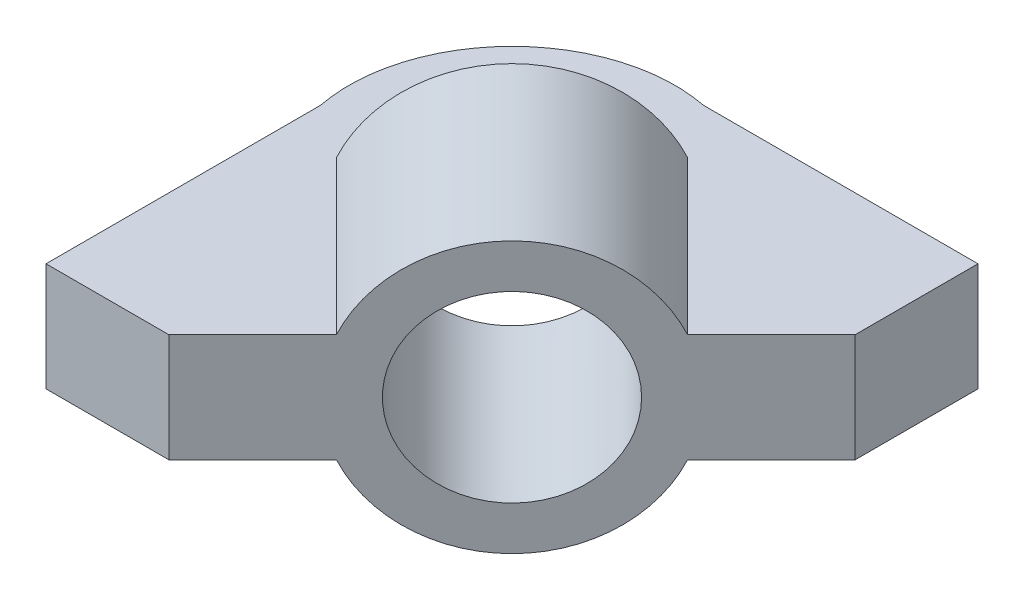
ISO-10303-21;
HEADER;
FILE_DESCRIPTION(('STEP AP214'),'2;1');
FILE_NAME('part.step','',(''),(''),'','','');
FILE_SCHEMA(('AUTOMOTIVE_DESIGN { 1 0 10303 214 1 1 1 1 }'));
ENDSEC;
DATA;
#1=APPLICATION_CONTEXT('core data for automotive mechanical design processes');
#2=APPLICATION_PROTOCOL_DEFINITION('international standard','automotive_design',2000,#1);
#3=PRODUCT_CONTEXT('',#1,'mechanical');
#4=PRODUCT('Part','Part','',(#3));
#5=PRODUCT_RELATED_PRODUCT_CATEGORY('part','',(#4));
#6=PRODUCT_DEFINITION_FORMATION('','',#4);
#7=PRODUCT_DEFINITION_CONTEXT('part definition',#1,'design');
#8=PRODUCT_DEFINITION('design','',#6,#7);
#9=PRODUCT_DEFINITION_SHAPE('','',#8);
#10=(LENGTH_UNIT() NAMED_UNIT(*) SI_UNIT(.MILLI.,.METRE.));
#11=(NAMED_UNIT(*) PLANE_ANGLE_UNIT() SI_UNIT($,.RADIAN.));
#12=(NAMED_UNIT(*) SI_UNIT($,.STERADIAN.) SOLID_ANGLE_UNIT());
#13=UNCERTAINTY_MEASURE_WITH_UNIT(LENGTH_MEASURE(1.E-05),#10,'distance_accuracy_value','');
#14=(GEOMETRIC_REPRESENTATION_CONTEXT(3) GLOBAL_UNCERTAINTY_ASSIGNED_CONTEXT((#13)) GLOBAL_UNIT_ASSIGNED_CONTEXT((#10,
#11,#12)) REPRESENTATION_CONTEXT('',''));
#15=CARTESIAN_POINT('',(0.,0.,0.));
#16=DIRECTION('',(0.,0.,1.));
#17=DIRECTION('',(1.,0.,0.));
#18=AXIS2_PLACEMENT_3D('',#15,#16,#17);
#19=CARTESIAN_POINT('',(0.,3.,0.));
#20=DIRECTION('',(0.,1.,0.));
#21=DIRECTION('',(0.,0.,1.));
#22=AXIS2_PLACEMENT_3D('',#19,#20,#21);
#23=PLANE('',#22);
#24=CARTESIAN_POINT('',(-0.349848925202614,3.,-0.357263409257611));
#25=DIRECTION('',(0.,1.,0.));
#26=DIRECTION('',(0.,0.,1.));
#27=AXIS2_PLACEMENT_3D('',#24,#25,#26);
#28=CIRCLE('',#27,1.5);
#29=CARTESIAN_POINT('',(-0.349848925202614,3.,1.14273659074239));
#30=VERTEX_POINT('',#29);
#31=EDGE_CURVE('E266',#30,#30,#28,.T.);
#32=ORIENTED_EDGE('',*,*,#31,.F.);
#33=EDGE_LOOP('',(#32));
#34=FACE_BOUND('',#33,.T.);
#35=DIRECTION('',(0.707106781186547,0.,-0.707106781186548));
#36=VECTOR('',#35,1.);
#37=CARTESIAN_POINT('',(2.5005764901377,3.,2.5005764901377));
#38=LINE('',#37,#36);
#39=CARTESIAN_POINT('',(-2.35997903366819,3.,7.3611320139436));
#40=VERTEX_POINT('',#39);
#41=CARTESIAN_POINT('',(-0.393868620760068,3.,5.39502160103547));
#42=VERTEX_POINT('',#41);
#43=EDGE_CURVE('E146',#40,#42,#38,.T.);
#44=ORIENTED_EDGE('',*,*,#43,.T.);
#45=DIRECTION('',(0.707106781186547,0.,-0.707106781186548));
#46=VECTOR('',#45,1.);
#47=CARTESIAN_POINT('',(2.5005764901377,3.,2.5005764901377));
#48=LINE('',#47,#46);
#49=CARTESIAN_POINT('',(5.39502160103547,3.,-0.39386862076007));
#50=VERTEX_POINT('',#49);
#51=EDGE_CURVE('E130',#42,#50,#48,.T.);
#52=ORIENTED_EDGE('',*,*,#51,.T.);
#53=CARTESIAN_POINT('',(7.3611320139436,3.,-2.35997903366819));
#54=VERTEX_POINT('',#53);
#55=EDGE_CURVE('E144',#50,#54,#38,.T.);
#56=ORIENTED_EDGE('',*,*,#55,.T.);
#57=DIRECTION('',(0.707106781186548,0.,0.707106781186547));
#58=VECTOR('',#57,1.);
#59=CARTESIAN_POINT('',(7.3611320139436,3.,-2.35997903366819));
#60=LINE('',#59,#58);
#61=CARTESIAN_POINT('',(15.8605555238059,3.,6.13944447619411));
#62=VERTEX_POINT('',#61);
#63=EDGE_CURVE('E166',#62,#54,#60,.F.);
#64=ORIENTED_EDGE('',*,*,#63,.F.);
#65=DIRECTION('',(-0.707106781186548,0.,0.707106781186548));
#66=VECTOR('',#65,1.);
#67=CARTESIAN_POINT('',(11.,3.,11.));
#68=LINE('',#67,#66);
#69=CARTESIAN_POINT('',(20.5,3.,1.5));
#70=VERTEX_POINT('',#69);
#71=EDGE_CURVE('E199',#70,#62,#68,.T.);
#72=ORIENTED_EDGE('',*,*,#71,.F.);
#73=DIRECTION('',(0.,0.,1.));
#74=VECTOR('',#73,1.);
#75=CARTESIAN_POINT('',(20.5,3.,0.));
#76=LINE('',#75,#74);
#77=CARTESIAN_POINT('',(20.5,3.,-5.30330085889911));
#78=VERTEX_POINT('',#77);
#79=EDGE_CURVE('E178',#78,#70,#76,.T.);
#80=ORIENTED_EDGE('',*,*,#79,.F.);
#81=DIRECTION('',(1.,0.,0.));
#82=VECTOR('',#81,1.);
#83=CARTESIAN_POINT('',(0.,3.,-5.30330085889911));
#84=LINE('',#83,#82);
#85=CARTESIAN_POINT('',(5.3033008588991,3.,-5.30330085889911));
#86=VERTEX_POINT('',#85);
#87=EDGE_CURVE('E182',#86,#78,#84,.T.);
#88=ORIENTED_EDGE('',*,*,#87,.F.);
#89=CARTESIAN_POINT('',(3.55763099284482,3.,3.55763099284481));
#90=DIRECTION('',(0.,1.,0.));
#91=DIRECTION('',(0.,0.,1.));
#92=AXIS2_PLACEMENT_3D('',#89,#90,#91);
#93=CIRCLE('',#92,9.03125);
#94=CARTESIAN_POINT('',(-5.3033008588991,3.,5.30330085889911));
#95=VERTEX_POINT('',#94);
#96=EDGE_CURVE('E187',#95,#86,#93,.F.);
#97=ORIENTED_EDGE('',*,*,#96,.F.);
#98=DIRECTION('',(0.,0.,1.));
#99=VECTOR('',#98,1.);
#100=CARTESIAN_POINT('',(-5.30330085889911,3.,0.));
#101=LINE('',#100,#99);
#102=CARTESIAN_POINT('',(-5.3033008588991,3.,20.5));
#103=VERTEX_POINT('',#102);
#104=EDGE_CURVE('E191',#95,#103,#101,.T.);
#105=ORIENTED_EDGE('',*,*,#104,.T.);
#106=DIRECTION('',(1.,0.,0.));
#107=VECTOR('',#106,1.);
#108=CARTESIAN_POINT('',(0.,3.,20.5));
#109=LINE('',#108,#107);
#110=CARTESIAN_POINT('',(1.5,3.,20.5));
#111=VERTEX_POINT('',#110);
#112=EDGE_CURVE('E194',#103,#111,#109,.T.);
#113=ORIENTED_EDGE('',*,*,#112,.T.);
#114=CARTESIAN_POINT('',(6.13944447619411,3.,15.8605555238059));
#115=VERTEX_POINT('',#114);
#116=EDGE_CURVE('E198',#115,#111,#68,.T.);
#117=ORIENTED_EDGE('',*,*,#116,.F.);
#118=DIRECTION('',(0.707106781186548,0.,0.707106781186547));
#119=VECTOR('',#118,1.);
#120=CARTESIAN_POINT('',(-2.35997903366819,3.,7.3611320139436));
#121=LINE('',#120,#119);
#122=EDGE_CURVE('E174',#40,#115,#121,.T.);
#123=ORIENTED_EDGE('',*,*,#122,.F.);
#124=EDGE_LOOP('',(#44,#52,#56,#64,#72,#80,#88,#97,#105,#113,#117,#123));
#125=FACE_BOUND('',#124,.T.);
#126=ADVANCED_FACE('F41',(#34,#125),#23,.T.);
#127=CARTESIAN_POINT('',(0.,-3.,0.));
#128=DIRECTION('',(0.,1.,0.));
#129=DIRECTION('',(0.,0.,1.));
#130=AXIS2_PLACEMENT_3D('',#127,#128,#129);
#131=PLANE('',#130);
#132=CARTESIAN_POINT('',(-0.349848925202614,-3.,-0.357263409257611));
#133=DIRECTION('',(0.,1.,0.));
#134=DIRECTION('',(0.,0.,1.));
#135=AXIS2_PLACEMENT_3D('',#132,#133,#134);
#136=CIRCLE('',#135,1.5);
#137=CARTESIAN_POINT('',(-0.349848925202614,-3.,1.14273659074239));
#138=VERTEX_POINT('',#137);
#139=EDGE_CURVE('E137',#138,#138,#136,.F.);
#140=ORIENTED_EDGE('',*,*,#139,.F.);
#141=EDGE_LOOP('',(#140));
#142=FACE_BOUND('',#141,.T.);
#143=DIRECTION('',(0.707106781186547,0.,-0.707106781186548));
#144=VECTOR('',#143,1.);
#145=CARTESIAN_POINT('',(2.5005764901377,-3.,2.5005764901377));
#146=LINE('',#145,#144);
#147=CARTESIAN_POINT('',(-0.393868620760068,-3.,5.39502160103547));
#148=VERTEX_POINT('',#147);
#149=CARTESIAN_POINT('',(5.39502160103547,-3.,-0.39386862076007));
#150=VERTEX_POINT('',#149);
#151=EDGE_CURVE('E131',#148,#150,#146,.T.);
#152=ORIENTED_EDGE('',*,*,#151,.F.);
#153=DIRECTION('',(0.707106781186547,0.,-0.707106781186548));
#154=VECTOR('',#153,1.);
#155=CARTESIAN_POINT('',(2.5005764901377,-3.,2.5005764901377));
#156=LINE('',#155,#154);
#157=CARTESIAN_POINT('',(-2.35997903366819,-3.,7.3611320139436));
#158=VERTEX_POINT('',#157);
#159=EDGE_CURVE('E50',#158,#148,#156,.T.);
#160=ORIENTED_EDGE('',*,*,#159,.F.);
#161=DIRECTION('',(0.707106781186548,0.,0.707106781186547));
#162=VECTOR('',#161,1.);
#163=CARTESIAN_POINT('',(-2.35997903366819,-3.,7.3611320139436));
#164=LINE('',#163,#162);
#165=CARTESIAN_POINT('',(6.13944447619411,-3.,15.8605555238059));
#166=VERTEX_POINT('',#165);
#167=EDGE_CURVE('E11',#158,#166,#164,.T.);
#168=ORIENTED_EDGE('',*,*,#167,.T.);
#169=DIRECTION('',(-0.707106781186548,0.,0.707106781186548));
#170=VECTOR('',#169,1.);
#171=CARTESIAN_POINT('',(11.,-3.,11.));
#172=LINE('',#171,#170);
#173=CARTESIAN_POINT('',(1.5,-3.,20.5));
#174=VERTEX_POINT('',#173);
#175=EDGE_CURVE('E222',#166,#174,#172,.T.);
#176=ORIENTED_EDGE('',*,*,#175,.T.);
#177=DIRECTION('',(1.,0.,0.));
#178=VECTOR('',#177,1.);
#179=CARTESIAN_POINT('',(0.,-3.,20.5));
#180=LINE('',#179,#178);
#181=CARTESIAN_POINT('',(-5.3033008588991,-3.,20.5));
#182=VERTEX_POINT('',#181);
#183=EDGE_CURVE('E218',#182,#174,#180,.T.);
#184=ORIENTED_EDGE('',*,*,#183,.F.);
#185=DIRECTION('',(0.,0.,1.));
#186=VECTOR('',#185,1.);
#187=CARTESIAN_POINT('',(-5.30330085889911,-3.,0.));
#188=LINE('',#187,#186);
#189=CARTESIAN_POINT('',(-5.3033008588991,-3.,5.30330085889911));
#190=VERTEX_POINT('',#189);
#191=EDGE_CURVE('E215',#190,#182,#188,.T.);
#192=ORIENTED_EDGE('',*,*,#191,.F.);
#193=CARTESIAN_POINT('',(3.55763099284482,-3.,3.55763099284481));
#194=DIRECTION('',(0.,1.,0.));
#195=DIRECTION('',(0.,0.,1.));
#196=AXIS2_PLACEMENT_3D('',#193,#194,#195);
#197=CIRCLE('',#196,9.03125);
#198=CARTESIAN_POINT('',(5.3033008588991,-3.,-5.30330085889911));
#199=VERTEX_POINT('',#198);
#200=EDGE_CURVE('E211',#190,#199,#197,.F.);
#201=ORIENTED_EDGE('',*,*,#200,.T.);
#202=DIRECTION('',(1.,0.,0.));
#203=VECTOR('',#202,1.);
#204=CARTESIAN_POINT('',(0.,-3.,-5.30330085889911));
#205=LINE('',#204,#203);
#206=CARTESIAN_POINT('',(20.5,-3.,-5.30330085889911));
#207=VERTEX_POINT('',#206);
#208=EDGE_CURVE('E207',#199,#207,#205,.T.);
#209=ORIENTED_EDGE('',*,*,#208,.T.);
#210=DIRECTION('',(0.,0.,1.));
#211=VECTOR('',#210,1.);
#212=CARTESIAN_POINT('',(20.5,-3.,0.));
#213=LINE('',#212,#211);
#214=CARTESIAN_POINT('',(20.5,-3.,1.5));
#215=VERTEX_POINT('',#214);
#216=EDGE_CURVE('E177',#207,#215,#213,.T.);
#217=ORIENTED_EDGE('',*,*,#216,.T.);
#218=CARTESIAN_POINT('',(15.8605555238059,-3.,6.1394444761941));
#219=VERTEX_POINT('',#218);
#220=EDGE_CURVE('E183',#215,#219,#172,.T.);
#221=ORIENTED_EDGE('',*,*,#220,.T.);
#222=DIRECTION('',(0.707106781186548,0.,0.707106781186547));
#223=VECTOR('',#222,1.);
#224=CARTESIAN_POINT('',(7.3611320139436,-3.,-2.35997903366819));
#225=LINE('',#224,#223);
#226=CARTESIAN_POINT('',(7.3611320139436,-3.,-2.35997903366819));
#227=VERTEX_POINT('',#226);
#228=EDGE_CURVE('E247',#219,#227,#225,.F.);
#229=ORIENTED_EDGE('',*,*,#228,.T.);
#230=EDGE_CURVE('E244',#150,#227,#156,.T.);
#231=ORIENTED_EDGE('',*,*,#230,.F.);
#232=EDGE_LOOP('',(#152,#160,#168,#176,#184,#192,#201,#209,#217,#221,#229,#231));
#233=FACE_BOUND('',#232,.T.);
#234=ADVANCED_FACE('F305',(#142,#233),#131,.F.);
#235=CARTESIAN_POINT('',(20.5,3.,0.));
#236=DIRECTION('',(1.,0.,0.));
#237=DIRECTION('',(0.,0.,-1.));
#238=AXIS2_PLACEMENT_3D('',#235,#236,#237);
#239=PLANE('',#238);
#240=ORIENTED_EDGE('',*,*,#216,.F.);
#241=DIRECTION('',(0.,-1.,0.));
#242=VECTOR('',#241,1.);
#243=CARTESIAN_POINT('',(20.5,3.,-5.30330085889911));
#244=LINE('',#243,#242);
#245=EDGE_CURVE('E241',#78,#207,#244,.T.);
#246=ORIENTED_EDGE('',*,*,#245,.F.);
#247=ORIENTED_EDGE('',*,*,#79,.T.);
#248=DIRECTION('',(0.,-1.,0.));
#249=VECTOR('',#248,1.);
#250=CARTESIAN_POINT('',(20.5,3.,1.5));
#251=LINE('',#250,#249);
#252=EDGE_CURVE('E203',#70,#215,#251,.T.);
#253=ORIENTED_EDGE('',*,*,#252,.T.);
#254=EDGE_LOOP('',(#240,#246,#247,#253));
#255=FACE_BOUND('',#254,.T.);
#256=ADVANCED_FACE('F43',(#255),#239,.T.);
#257=CARTESIAN_POINT('',(0.,3.,-5.30330085889911));
#258=DIRECTION('',(0.,0.,-1.));
#259=DIRECTION('',(-1.,0.,0.));
#260=AXIS2_PLACEMENT_3D('',#257,#258,#259);
#261=PLANE('',#260);
#262=CARTESIAN_POINT('',(15.,0.,-5.30330085889911));
#263=DIRECTION('',(0.,0.,-1.));
#264=DIRECTION('',(-1.,0.,0.));
#265=AXIS2_PLACEMENT_3D('',#262,#263,#264);
#266=CIRCLE('',#265,1.5);
#267=CARTESIAN_POINT('',(13.5,0.,-5.30330085889911));
#268=VERTEX_POINT('',#267);
#269=EDGE_CURVE('E279',#268,#268,#266,.T.);
#270=ORIENTED_EDGE('',*,*,#269,.F.);
#271=EDGE_LOOP('',(#270));
#272=FACE_BOUND('',#271,.T.);
#273=ORIENTED_EDGE('',*,*,#208,.F.);
#274=DIRECTION('',(0.,-1.,0.));
#275=VECTOR('',#274,1.);
#276=CARTESIAN_POINT('',(5.3033008588991,3.,-5.30330085889911));
#277=LINE('',#276,#275);
#278=EDGE_CURVE('E238',#86,#199,#277,.T.);
#279=ORIENTED_EDGE('',*,*,#278,.F.);
#280=ORIENTED_EDGE('',*,*,#87,.T.);
#281=ORIENTED_EDGE('',*,*,#245,.T.);
#282=EDGE_LOOP('',(#273,#279,#280,#281));
#283=FACE_BOUND('',#282,.T.);
#284=ADVANCED_FACE('F296',(#272,#283),#261,.T.);
#285=CARTESIAN_POINT('',(3.55763099284482,3.,3.55763099284481));
#286=DIRECTION('',(0.,-1.,0.));
#287=DIRECTION('',(0.,0.,-1.));
#288=AXIS2_PLACEMENT_3D('',#285,#286,#287);
#289=CYLINDRICAL_SURFACE('',#288,9.03125);
#290=ORIENTED_EDGE('',*,*,#200,.F.);
#291=DIRECTION('',(0.,-1.,0.));
#292=VECTOR('',#291,1.);
#293=CARTESIAN_POINT('',(-5.3033008588991,3.,5.30330085889911));
#294=LINE('',#293,#292);
#295=EDGE_CURVE('E235',#95,#190,#294,.T.);
#296=ORIENTED_EDGE('',*,*,#295,.F.);
#297=ORIENTED_EDGE('',*,*,#96,.T.);
#298=ORIENTED_EDGE('',*,*,#278,.T.);
#299=EDGE_LOOP('',(#290,#296,#297,#298));
#300=FACE_BOUND('',#299,.T.);
#301=ADVANCED_FACE('F299',(#300),#289,.T.);
#302=CARTESIAN_POINT('',(-5.30330085889911,3.,0.));
#303=DIRECTION('',(1.,0.,0.));
#304=DIRECTION('',(0.,0.,-1.));
#305=AXIS2_PLACEMENT_3D('',#302,#303,#304);
#306=PLANE('',#305);
#307=CARTESIAN_POINT('',(-5.30330085889911,0.,15.));
#308=DIRECTION('',(-1.,0.,0.));
#309=DIRECTION('',(0.,0.,1.));
#310=AXIS2_PLACEMENT_3D('',#307,#308,#309);
#311=CIRCLE('',#310,1.5);
#312=CARTESIAN_POINT('',(-5.30330085889911,0.,16.5));
#313=VERTEX_POINT('',#312);
#314=EDGE_CURVE('E271',#313,#313,#311,.T.);
#315=ORIENTED_EDGE('',*,*,#314,.F.);
#316=EDGE_LOOP('',(#315));
#317=FACE_BOUND('',#316,.T.);
#318=ORIENTED_EDGE('',*,*,#191,.T.);
#319=DIRECTION('',(0.,-1.,0.));
#320=VECTOR('',#319,1.);
#321=CARTESIAN_POINT('',(-5.3033008588991,3.,20.5));
#322=LINE('',#321,#320);
#323=EDGE_CURVE('E231',#103,#182,#322,.T.);
#324=ORIENTED_EDGE('',*,*,#323,.F.);
#325=ORIENTED_EDGE('',*,*,#104,.F.);
#326=ORIENTED_EDGE('',*,*,#295,.T.);
#327=EDGE_LOOP('',(#318,#324,#325,#326));
#328=FACE_BOUND('',#327,.T.);
#329=ADVANCED_FACE('F333',(#317,#328),#306,.F.);
#330=CARTESIAN_POINT('',(0.,3.,20.5));
#331=DIRECTION('',(0.,0.,-1.));
#332=DIRECTION('',(-1.,0.,0.));
#333=AXIS2_PLACEMENT_3D('',#330,#331,#332);
#334=PLANE('',#333);
#335=ORIENTED_EDGE('',*,*,#183,.T.);
#336=DIRECTION('',(0.,-1.,0.));
#337=VECTOR('',#336,1.);
#338=CARTESIAN_POINT('',(1.5,3.,20.5));
#339=LINE('',#338,#337);
#340=EDGE_CURVE('E227',#111,#174,#339,.T.);
#341=ORIENTED_EDGE('',*,*,#340,.F.);
#342=ORIENTED_EDGE('',*,*,#112,.F.);
#343=ORIENTED_EDGE('',*,*,#323,.T.);
#344=EDGE_LOOP('',(#335,#341,#342,#343));
#345=FACE_BOUND('',#344,.T.);
#346=ADVANCED_FACE('F331',(#345),#334,.F.);
#347=CARTESIAN_POINT('',(11.,3.,11.));
#348=DIRECTION('',(0.707106781186547,0.,0.707106781186547));
#349=DIRECTION('',(0.707106781186548,0.,-0.707106781186548));
#350=AXIS2_PLACEMENT_3D('',#347,#348,#349);
#351=PLANE('',#350);
#352=CARTESIAN_POINT('',(11.,0.,11.));
#353=DIRECTION('',(0.707106781186548,0.,0.707106781186547));
#354=DIRECTION('',(0.707106781186547,0.,-0.707106781186548));
#355=AXIS2_PLACEMENT_3D('',#352,#353,#354);
#356=CIRCLE('',#355,5.075);
#357=CARTESIAN_POINT('',(14.5885669145217,0.,7.41143308547827));
#358=VERTEX_POINT('',#357);
#359=EDGE_CURVE('E148',#358,#358,#356,.T.);
#360=ORIENTED_EDGE('',*,*,#359,.F.);
#361=EDGE_LOOP('',(#360));
#362=FACE_BOUND('',#361,.T.);
#363=ORIENTED_EDGE('',*,*,#71,.T.);
#364=CARTESIAN_POINT('',(11.,0.,11.));
#365=DIRECTION('',(0.707106781186548,0.,0.707106781186547));
#366=DIRECTION('',(0.707106781186547,0.,-0.707106781186548));
#367=AXIS2_PLACEMENT_3D('',#364,#365,#366);
#368=CIRCLE('',#367,7.5);
#369=EDGE_CURVE('E171',#62,#115,#368,.T.);
#370=ORIENTED_EDGE('',*,*,#369,.T.);
#371=ORIENTED_EDGE('',*,*,#116,.T.);
#372=ORIENTED_EDGE('',*,*,#340,.T.);
#373=ORIENTED_EDGE('',*,*,#175,.F.);
#374=EDGE_CURVE('E155',#166,#219,#368,.T.);
#375=ORIENTED_EDGE('',*,*,#374,.T.);
#376=ORIENTED_EDGE('',*,*,#220,.F.);
#377=ORIENTED_EDGE('',*,*,#252,.F.);
#378=EDGE_LOOP('',(#363,#370,#371,#372,#373,#375,#376,#377));
#379=FACE_BOUND('',#378,.T.);
#380=ADVANCED_FACE('F317',(#362,#379),#351,.T.);
#381=CARTESIAN_POINT('',(2.5005764901377,0.,2.5005764901377));
#382=DIRECTION('',(0.707106781186548,0.,0.707106781186547));
#383=DIRECTION('',(0.707106781186547,0.,-0.707106781186548));
#384=AXIS2_PLACEMENT_3D('',#381,#382,#383);
#385=CYLINDRICAL_SURFACE('',#384,5.075);
#386=ORIENTED_EDGE('',*,*,#359,.T.);
#387=EDGE_LOOP('',(#386));
#388=FACE_BOUND('',#387,.T.);
#389=CARTESIAN_POINT('',(2.5005764901377,0.,2.5005764901377));
#390=DIRECTION('',(0.707106781186548,0.,0.707106781186547));
#391=DIRECTION('',(0.707106781186547,0.,-0.707106781186548));
#392=AXIS2_PLACEMENT_3D('',#389,#390,#391);
#393=CIRCLE('',#392,5.075);
#394=EDGE_CURVE('E156',#148,#150,#393,.T.);
#395=ORIENTED_EDGE('',*,*,#394,.F.);
#396=CARTESIAN_POINT('',(2.5005764901377,0.,2.5005764901377));
#397=DIRECTION('',(0.707106781186548,0.,0.707106781186547));
#398=DIRECTION('',(0.707106781186547,0.,-0.707106781186548));
#399=AXIS2_PLACEMENT_3D('',#396,#397,#398);
#400=CIRCLE('',#399,5.075);
#401=EDGE_CURVE('E63',#42,#148,#400,.T.);
#402=ORIENTED_EDGE('',*,*,#401,.F.);
#403=EDGE_CURVE('E151',#50,#42,#393,.T.);
#404=ORIENTED_EDGE('',*,*,#403,.F.);
#405=EDGE_CURVE('E127',#150,#50,#400,.T.);
#406=ORIENTED_EDGE('',*,*,#405,.F.);
#407=EDGE_LOOP('',(#395,#402,#404,#406));
#408=FACE_BOUND('',#407,.T.);
#409=ADVANCED_FACE('F152',(#388,#408),#385,.F.);
#410=CARTESIAN_POINT('',(2.5005764901377,0.,2.5005764901377));
#411=DIRECTION('',(0.707106781186548,0.,0.707106781186547));
#412=DIRECTION('',(0.707106781186547,0.,-0.707106781186548));
#413=AXIS2_PLACEMENT_3D('',#410,#411,#412);
#414=PLANE('',#413);
#415=CARTESIAN_POINT('',(2.5005764901377,0.,2.5005764901377));
#416=DIRECTION('',(0.707106781186548,0.,0.707106781186547));
#417=DIRECTION('',(0.707106781186547,0.,-0.707106781186548));
#418=AXIS2_PLACEMENT_3D('',#415,#416,#417);
#419=CIRCLE('',#418,7.5);
#420=EDGE_CURVE('E167',#158,#227,#419,.T.);
#421=ORIENTED_EDGE('',*,*,#420,.F.);
#422=ORIENTED_EDGE('',*,*,#159,.T.);
#423=ORIENTED_EDGE('',*,*,#394,.T.);
#424=ORIENTED_EDGE('',*,*,#230,.T.);
#425=EDGE_LOOP('',(#421,#422,#423,#424));
#426=FACE_BOUND('',#425,.T.);
#427=ADVANCED_FACE('F254',(#426),#414,.F.);
#428=CARTESIAN_POINT('',(2.5005764901377,0.,2.5005764901377));
#429=DIRECTION('',(0.707106781186548,0.,0.707106781186547));
#430=DIRECTION('',(0.707106781186547,0.,-0.707106781186548));
#431=AXIS2_PLACEMENT_3D('',#428,#429,#430);
#432=CYLINDRICAL_SURFACE('',#431,7.5);
#433=ORIENTED_EDGE('',*,*,#167,.F.);
#434=ORIENTED_EDGE('',*,*,#420,.T.);
#435=ORIENTED_EDGE('',*,*,#228,.F.);
#436=ORIENTED_EDGE('',*,*,#374,.F.);
#437=EDGE_LOOP('',(#433,#434,#435,#436));
#438=FACE_BOUND('',#437,.T.);
#439=ADVANCED_FACE('F326',(#438),#432,.T.);
#440=EDGE_CURVE('E161',#54,#40,#419,.T.);
#441=ORIENTED_EDGE('',*,*,#440,.T.);
#442=ORIENTED_EDGE('',*,*,#122,.T.);
#443=ORIENTED_EDGE('',*,*,#369,.F.);
#444=ORIENTED_EDGE('',*,*,#63,.T.);
#445=EDGE_LOOP('',(#441,#442,#443,#444));
#446=FACE_BOUND('',#445,.T.);
#447=ADVANCED_FACE('F354',(#446),#432,.T.);
#448=ORIENTED_EDGE('',*,*,#43,.F.);
#449=ORIENTED_EDGE('',*,*,#440,.F.);
#450=ORIENTED_EDGE('',*,*,#55,.F.);
#451=ORIENTED_EDGE('',*,*,#403,.T.);
#452=EDGE_LOOP('',(#448,#449,#450,#451));
#453=FACE_BOUND('',#452,.T.);
#454=ADVANCED_FACE('F159',(#453),#414,.F.);
#455=CARTESIAN_POINT('',(2.5005764901377,0.,2.5005764901377));
#456=DIRECTION('',(0.707106781186548,0.,0.707106781186547));
#457=DIRECTION('',(0.707106781186547,0.,-0.707106781186548));
#458=AXIS2_PLACEMENT_3D('',#455,#456,#457);
#459=PLANE('',#458);
#460=ORIENTED_EDGE('',*,*,#401,.T.);
#461=ORIENTED_EDGE('',*,*,#151,.T.);
#462=ORIENTED_EDGE('',*,*,#405,.T.);
#463=ORIENTED_EDGE('',*,*,#51,.F.);
#464=EDGE_LOOP('',(#460,#461,#462,#463));
#465=FACE_BOUND('',#464,.T.);
#466=ADVANCED_FACE('F129',(#465),#459,.T.);
#467=CARTESIAN_POINT('',(-0.349848925202614,-7.24264068711929,-0.357263409257611));
#468=DIRECTION('',(0.,1.,0.));
#469=DIRECTION('',(0.,0.,1.));
#470=AXIS2_PLACEMENT_3D('',#467,#468,#469);
#471=CYLINDRICAL_SURFACE('',#470,1.5);
#472=CARTESIAN_POINT('',(-0.349848925202614,-3.,1.14273659074239));
#473=CARTESIAN_POINT('',(-0.349848925202614,-2.9375,1.14273659074239));
#474=CARTESIAN_POINT('',(-0.349848925202614,-2.875,1.14273659074239));
#475=CARTESIAN_POINT('',(-0.349848925202614,-2.75,1.14273659074239));
#476=CARTESIAN_POINT('',(-0.349848925202614,-2.6875,1.14273659074239));
#477=CARTESIAN_POINT('',(-0.349848925202614,-2.5625,1.14273659074239));
#478=CARTESIAN_POINT('',(-0.349848925202614,-2.5,1.14273659074239));
#479=CARTESIAN_POINT('',(-0.349848925202614,-2.375,1.14273659074239));
#480=CARTESIAN_POINT('',(-0.349848925202614,-2.3125,1.14273659074239));
#481=CARTESIAN_POINT('',(-0.349848925202614,-2.1875,1.14273659074239));
#482=CARTESIAN_POINT('',(-0.349848925202614,-2.125,1.14273659074239));
#483=CARTESIAN_POINT('',(-0.349848925202614,-2.,1.14273659074239));
#484=CARTESIAN_POINT('',(-0.349848925202614,-1.9375,1.14273659074239));
#485=CARTESIAN_POINT('',(-0.349848925202614,-1.8125,1.14273659074239));
#486=CARTESIAN_POINT('',(-0.349848925202614,-1.75,1.14273659074239));
#487=CARTESIAN_POINT('',(-0.349848925202614,-1.625,1.14273659074239));
#488=CARTESIAN_POINT('',(-0.349848925202614,-1.5625,1.14273659074239));
#489=CARTESIAN_POINT('',(-0.349848925202614,-1.4375,1.14273659074239));
#490=CARTESIAN_POINT('',(-0.349848925202614,-1.375,1.14273659074239));
#491=CARTESIAN_POINT('',(-0.349848925202614,-1.25,1.14273659074239));
#492=CARTESIAN_POINT('',(-0.349848925202614,-1.1875,1.14273659074239));
#493=CARTESIAN_POINT('',(-0.349848925202614,-1.0625,1.14273659074239));
#494=CARTESIAN_POINT('',(-0.349848925202614,-1.,1.14273659074239));
#495=CARTESIAN_POINT('',(-0.349848925202614,-0.875000000000001,1.14273659074239));
#496=CARTESIAN_POINT('',(-0.349848925202614,-0.812500000000001,1.14273659074239));
#497=CARTESIAN_POINT('',(-0.349848925202614,-0.687500000000001,1.14273659074239));
#498=CARTESIAN_POINT('',(-0.349848925202614,-0.625000000000001,1.14273659074239));
#499=CARTESIAN_POINT('',(-0.349848925202614,-0.5,1.14273659074239));
#500=CARTESIAN_POINT('',(-0.349848925202614,-0.4375,1.14273659074239));
#501=CARTESIAN_POINT('',(-0.349848925202614,-0.312500000000001,1.14273659074239));
#502=CARTESIAN_POINT('',(-0.349848925202614,-0.250000000000001,1.14273659074239));
#503=CARTESIAN_POINT('',(-0.349848925202614,-0.125000000000001,1.14273659074239));
#504=CARTESIAN_POINT('',(-0.349848925202614,-0.0625000000000009,1.14273659074239));
#505=CARTESIAN_POINT('',(-0.349848925202614,0.0624999999999992,1.14273659074239));
#506=CARTESIAN_POINT('',(-0.349848925202614,0.124999999999999,1.14273659074239));
#507=CARTESIAN_POINT('',(-0.349848925202614,0.249999999999999,1.14273659074239));
#508=CARTESIAN_POINT('',(-0.349848925202614,0.312499999999999,1.14273659074239));
#509=CARTESIAN_POINT('',(-0.349848925202614,0.437499999999999,1.14273659074239));
#510=CARTESIAN_POINT('',(-0.349848925202614,0.499999999999999,1.14273659074239));
#511=CARTESIAN_POINT('',(-0.349848925202614,0.624999999999998,1.14273659074239));
#512=CARTESIAN_POINT('',(-0.349848925202614,0.687499999999998,1.14273659074239));
#513=CARTESIAN_POINT('',(-0.349848925202614,0.812499999999998,1.14273659074239));
#514=CARTESIAN_POINT('',(-0.349848925202614,0.874999999999998,1.14273659074239));
#515=CARTESIAN_POINT('',(-0.349848925202614,0.999999999999998,1.14273659074239));
#516=CARTESIAN_POINT('',(-0.349848925202614,1.0625,1.14273659074239));
#517=CARTESIAN_POINT('',(-0.349848925202614,1.1875,1.14273659074239));
#518=CARTESIAN_POINT('',(-0.349848925202614,1.25,1.14273659074239));
#519=CARTESIAN_POINT('',(-0.349848925202614,1.375,1.14273659074239));
#520=CARTESIAN_POINT('',(-0.349848925202614,1.4375,1.14273659074239));
#521=CARTESIAN_POINT('',(-0.349848925202614,1.5625,1.14273659074239));
#522=CARTESIAN_POINT('',(-0.349848925202614,1.625,1.14273659074239));
#523=CARTESIAN_POINT('',(-0.349848925202614,1.75,1.14273659074239));
#524=CARTESIAN_POINT('',(-0.349848925202614,1.8125,1.14273659074239));
#525=CARTESIAN_POINT('',(-0.349848925202614,1.9375,1.14273659074239));
#526=CARTESIAN_POINT('',(-0.349848925202614,2.,1.14273659074239));
#527=CARTESIAN_POINT('',(-0.349848925202614,2.125,1.14273659074239));
#528=CARTESIAN_POINT('',(-0.349848925202614,2.1875,1.14273659074239));
#529=CARTESIAN_POINT('',(-0.349848925202614,2.3125,1.14273659074239));
#530=CARTESIAN_POINT('',(-0.349848925202614,2.375,1.14273659074239));
#531=CARTESIAN_POINT('',(-0.349848925202614,2.5,1.14273659074239));
#532=CARTESIAN_POINT('',(-0.349848925202614,2.5625,1.14273659074239));
#533=CARTESIAN_POINT('',(-0.349848925202614,2.6875,1.14273659074239));
#534=CARTESIAN_POINT('',(-0.349848925202614,2.75,1.14273659074239));
#535=CARTESIAN_POINT('',(-0.349848925202614,2.875,1.14273659074239));
#536=CARTESIAN_POINT('',(-0.349848925202614,2.9375,1.14273659074239));
#537=CARTESIAN_POINT('',(-0.349848925202614,3.,1.14273659074239));
#538=B_SPLINE_CURVE_WITH_KNOTS('',3,(#472,#473,#474,#475,#476,#477,#478,#479,#480,#481,#482,
#483,#484,#485,#486,#487,#488,#489,#490,#491,#492,#493,#494,#495,#496,#497,#498,#499,#500,#501,
#502,#503,#504,#505,#506,#507,#508,#509,#510,#511,#512,#513,#514,#515,#516,#517,#518,#519,#520,
#521,#522,#523,#524,#525,#526,#527,#528,#529,#530,#531,#532,#533,#534,#535,#536,#537),
.UNSPECIFIED.,.F.,.F.,(4,2,2,2,2,2,2,2,2,2,2,2,2,2,2,2,2,2,2,2,2,2,2,2,2,2,2,2,2,2,2,2,4),(0.,
0.1875,0.375,0.5625,0.75,0.9375,1.125,1.3125,1.5,1.6875,1.875,2.0625,2.25,2.4375,2.625,2.8125,
3.,3.1875,3.375,3.5625,3.75,3.9375,4.125,4.3125,4.5,4.6875,4.875,5.0625,5.25,5.4375,5.625,
5.8125,6.),.UNSPECIFIED.);
#539=EDGE_CURVE('BSEAM375',#138,#30,#538,.T.);
#540=ORIENTED_EDGE('',*,*,#139,.T.);
#541=ORIENTED_EDGE('',*,*,#31,.T.);
#542=ORIENTED_EDGE('',*,*,#539,.T.);
#543=ORIENTED_EDGE('',*,*,#539,.F.);
#544=EDGE_LOOP('',(#540,#542,#541,#543));
#545=FACE_BOUND('',#544,.T.);
#546=ADVANCED_FACE('F375',(#545),#471,.F.);
#547=CARTESIAN_POINT('',(-2.30330085889911,0.,15.));
#548=DIRECTION('',(-1.,0.,0.));
#549=DIRECTION('',(0.,0.,1.));
#550=AXIS2_PLACEMENT_3D('',#547,#548,#549);
#551=CYLINDRICAL_SURFACE('',#550,1.5);
#552=CARTESIAN_POINT('',(-2.30330085889911,0.,15.));
#553=DIRECTION('',(-1.,0.,0.));
#554=DIRECTION('',(0.,0.,1.));
#555=AXIS2_PLACEMENT_3D('',#552,#553,#554);
#556=CIRCLE('',#555,1.5);
#557=CARTESIAN_POINT('',(-2.30330085889911,0.,16.5));
#558=VERTEX_POINT('',#557);
#559=EDGE_CURVE('E270',#558,#558,#556,.T.);
#560=ORIENTED_EDGE('',*,*,#559,.F.);
#561=EDGE_LOOP('',(#560));
#562=FACE_BOUND('',#561,.T.);
#563=ORIENTED_EDGE('',*,*,#314,.T.);
#564=EDGE_LOOP('',(#563));
#565=FACE_BOUND('',#564,.T.);
#566=ADVANCED_FACE('F421',(#562,#565),#551,.F.);
#567=CARTESIAN_POINT('',(-2.30330085889911,0.,15.));
#568=DIRECTION('',(-1.,0.,0.));
#569=DIRECTION('',(0.,0.,1.));
#570=AXIS2_PLACEMENT_3D('',#567,#568,#569);
#571=PLANE('',#570);
#572=ORIENTED_EDGE('',*,*,#559,.T.);
#573=EDGE_LOOP('',(#572));
#574=FACE_BOUND('',#573,.T.);
#575=ADVANCED_FACE('F292',(#574),#571,.T.);
#576=CARTESIAN_POINT('',(15.,0.,-2.30330085889911));
#577=DIRECTION('',(0.,0.,-1.));
#578=DIRECTION('',(-1.,0.,0.));
#579=AXIS2_PLACEMENT_3D('',#576,#577,#578);
#580=CYLINDRICAL_SURFACE('',#579,1.5);
#581=CARTESIAN_POINT('',(15.,0.,-2.30330085889911));
#582=DIRECTION('',(0.,0.,-1.));
#583=DIRECTION('',(-1.,0.,0.));
#584=AXIS2_PLACEMENT_3D('',#581,#582,#583);
#585=CIRCLE('',#584,1.5);
#586=CARTESIAN_POINT('',(13.5,0.,-2.30330085889911));
#587=VERTEX_POINT('',#586);
#588=EDGE_CURVE('E275',#587,#587,#585,.T.);
#589=ORIENTED_EDGE('',*,*,#588,.F.);
#590=EDGE_LOOP('',(#589));
#591=FACE_BOUND('',#590,.T.);
#592=ORIENTED_EDGE('',*,*,#269,.T.);
#593=EDGE_LOOP('',(#592));
#594=FACE_BOUND('',#593,.T.);
#595=ADVANCED_FACE('F289',(#591,#594),#580,.F.);
#596=CARTESIAN_POINT('',(15.,0.,-2.30330085889911));
#597=DIRECTION('',(0.,0.,-1.));
#598=DIRECTION('',(-1.,0.,0.));
#599=AXIS2_PLACEMENT_3D('',#596,#597,#598);
#600=PLANE('',#599);
#601=ORIENTED_EDGE('',*,*,#588,.T.);
#602=EDGE_LOOP('',(#601));
#603=FACE_BOUND('',#602,.T.);
#604=ADVANCED_FACE('F287',(#603),#600,.T.);
#605=CLOSED_SHELL('',(#126,#234,#256,#284,#301,#329,#346,#380,#409,#427,#439,#447,#454,#466,
#546,#566,#575,#595,#604));
#606=MANIFOLD_SOLID_BREP('B2',#605);
#607=ADVANCED_BREP_SHAPE_REPRESENTATION('',(#18,#606),#14);
#608=SHAPE_DEFINITION_REPRESENTATION(#9,#607);
ENDSEC;
END-ISO-10303-21;
